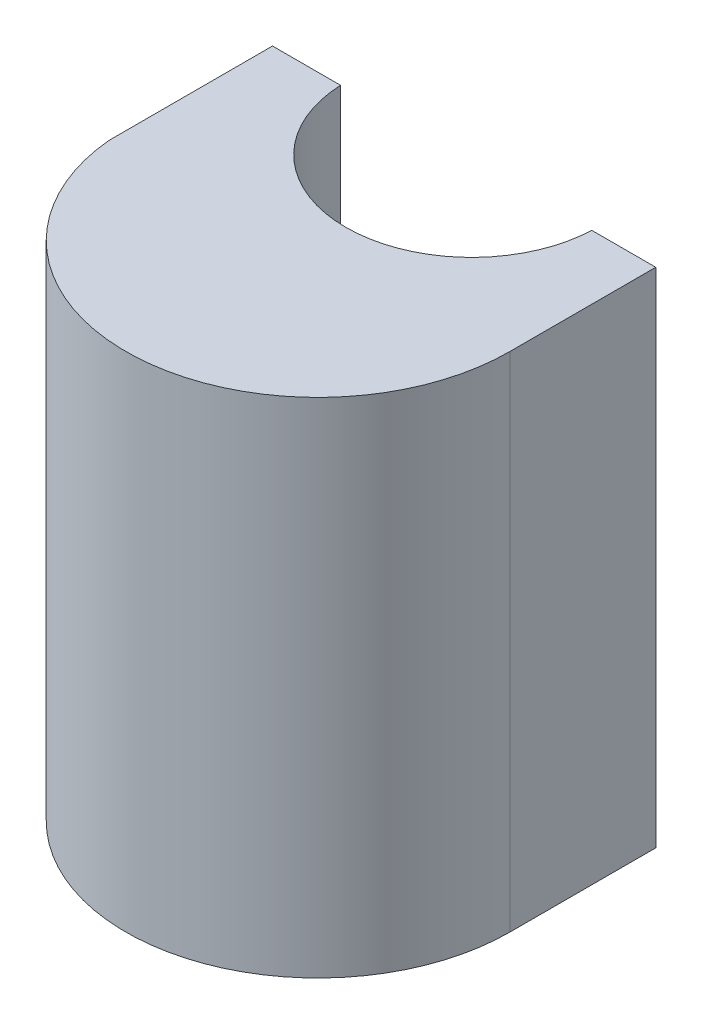
ISO-10303-21;
HEADER;
FILE_DESCRIPTION(('STEP AP214'),'2;1');
FILE_NAME('part.step','',(''),(''),'','','');
FILE_SCHEMA(('AUTOMOTIVE_DESIGN { 1 0 10303 214 1 1 1 1 }'));
ENDSEC;
DATA;
#1=APPLICATION_CONTEXT('core data for automotive mechanical design processes');
#2=APPLICATION_PROTOCOL_DEFINITION('international standard','automotive_design',2000,#1);
#3=PRODUCT_CONTEXT('',#1,'mechanical');
#4=PRODUCT('Part','Part','',(#3));
#5=PRODUCT_RELATED_PRODUCT_CATEGORY('part','',(#4));
#6=PRODUCT_DEFINITION_FORMATION('','',#4);
#7=PRODUCT_DEFINITION_CONTEXT('part definition',#1,'design');
#8=PRODUCT_DEFINITION('design','',#6,#7);
#9=PRODUCT_DEFINITION_SHAPE('','',#8);
#10=(LENGTH_UNIT() NAMED_UNIT(*) SI_UNIT(.MILLI.,.METRE.));
#11=(NAMED_UNIT(*) PLANE_ANGLE_UNIT() SI_UNIT($,.RADIAN.));
#12=(NAMED_UNIT(*) SI_UNIT($,.STERADIAN.) SOLID_ANGLE_UNIT());
#13=UNCERTAINTY_MEASURE_WITH_UNIT(LENGTH_MEASURE(1.E-05),#10,'distance_accuracy_value','');
#14=(GEOMETRIC_REPRESENTATION_CONTEXT(3) GLOBAL_UNCERTAINTY_ASSIGNED_CONTEXT((#13)) GLOBAL_UNIT_ASSIGNED_CONTEXT((#10,
#11,#12)) REPRESENTATION_CONTEXT('',''));
#15=CARTESIAN_POINT('',(0.,0.,0.));
#16=DIRECTION('',(0.,0.,1.));
#17=DIRECTION('',(1.,0.,0.));
#18=AXIS2_PLACEMENT_3D('',#15,#16,#17);
#19=CARTESIAN_POINT('',(1.26536763995208,2.87183105039429,15.5890947887312));
#20=DIRECTION('',(0.,1.,0.));
#21=DIRECTION('',(0.,0.,-1.));
#22=AXIS2_PLACEMENT_3D('',#19,#20,#21);
#23=PLANE('',#22);
#24=DIRECTION('',(2.31603663807447E-12,0.,-1.));
#25=VECTOR('',#24,1.);
#26=CARTESIAN_POINT('',(-5.63585159552637,2.87183105039428,7.0923266892118));
#27=LINE('',#26,#25);
#28=CARTESIAN_POINT('',(-5.63585159552637,2.87183105039428,7.0923266892118));
#29=VERTEX_POINT('',#28);
#30=CARTESIAN_POINT('',(-5.63585159552547,2.87183105039428,6.70112871047515));
#31=VERTEX_POINT('',#30);
#32=EDGE_CURVE('E105',#29,#31,#27,.T.);
#33=ORIENTED_EDGE('',*,*,#32,.F.);
#34=CARTESIAN_POINT('',(-5.17955820054254,2.87183105039428,7.04923878887403));
#35=DIRECTION('',(0.,1.,0.));
#36=DIRECTION('',(-0.995571061700838,0.,0.0940120263788917));
#37=AXIS2_PLACEMENT_3D('',#34,#35,#36);
#38=CIRCLE('',#37,0.458323280514298);
#39=CARTESIAN_POINT('',(-4.72123492002826,2.87183105039428,7.04923878887417));
#40=VERTEX_POINT('',#39);
#41=EDGE_CURVE('E100',#29,#40,#38,.T.);
#42=ORIENTED_EDGE('',*,*,#41,.T.);
#43=DIRECTION('',(7.39892430869169E-12,0.,1.));
#44=VECTOR('',#43,1.);
#45=CARTESIAN_POINT('',(-4.72123492003083,2.87183105039428,6.70112871047536));
#46=LINE('',#45,#44);
#47=CARTESIAN_POINT('',(-4.72123492003083,2.87183105039428,6.70112871047536));
#48=VERTEX_POINT('',#47);
#49=EDGE_CURVE('E26',#48,#40,#46,.T.);
#50=ORIENTED_EDGE('',*,*,#49,.F.);
#51=DIRECTION('',(-1.,0.,-5.81579420434685E-13));
#52=VECTOR('',#51,1.);
#53=CARTESIAN_POINT('',(-4.72123492003083,2.87183105039428,6.70112871047536));
#54=LINE('',#53,#52);
#55=CARTESIAN_POINT('',(-4.87380129724814,2.87183105039428,6.70112871047527));
#56=VERTEX_POINT('',#55);
#57=EDGE_CURVE('E11',#48,#56,#54,.T.);
#58=ORIENTED_EDGE('',*,*,#57,.T.);
#59=CARTESIAN_POINT('',(-5.17353236004814,2.87183105039428,6.68842871047527));
#60=DIRECTION('',(0.,1.,0.));
#61=DIRECTION('',(-0.999103542626009,0.,0.0423333333457055));
#62=AXIS2_PLACEMENT_3D('',#59,#60,#61);
#63=CIRCLE('',#62,0.299999999999993);
#64=CARTESIAN_POINT('',(-5.17363750475006,2.87183105039428,6.9884286920496));
#65=VERTEX_POINT('',#64);
#66=EDGE_CURVE('E136',#65,#56,#63,.T.);
#67=ORIENTED_EDGE('',*,*,#66,.F.);
#68=CARTESIAN_POINT('',(-5.17374264940921,2.87183105039428,6.68842871047527));
#69=DIRECTION('',(0.,1.,0.));
#70=DIRECTION('',(0.,0.,1.));
#71=AXIS2_PLACEMENT_3D('',#68,#69,#70);
#72=CIRCLE('',#71,0.299999999999994);
#73=CARTESIAN_POINT('',(-5.47347371219718,2.87183105039428,6.70112871047518));
#74=VERTEX_POINT('',#73);
#75=EDGE_CURVE('E152',#74,#65,#72,.T.);
#76=ORIENTED_EDGE('',*,*,#75,.F.);
#77=DIRECTION('',(-1.,0.,-2.19014998791785E-13));
#78=VECTOR('',#77,1.);
#79=CARTESIAN_POINT('',(-5.47347371219718,2.87183105039428,6.70112871047518));
#80=LINE('',#79,#78);
#81=EDGE_CURVE('E106',#74,#31,#80,.T.);
#82=ORIENTED_EDGE('',*,*,#81,.T.);
#83=EDGE_LOOP('',(#33,#42,#50,#58,#67,#76,#82));
#84=FACE_BOUND('',#83,.T.);
#85=ADVANCED_FACE('F17',(#84),#23,.T.);
#86=CARTESIAN_POINT('',(-4.87380129724814,2.87183105039428,6.70112871047527));
#87=DIRECTION('',(5.81579420434685E-13,0.,-1.));
#88=DIRECTION('',(0.,-1.,0.));
#89=AXIS2_PLACEMENT_3D('',#86,#87,#88);
#90=PLANE('',#89);
#91=DIRECTION('',(-1.,0.,-5.81579420434685E-13));
#92=VECTOR('',#91,1.);
#93=CARTESIAN_POINT('',(-1.80421682864544,1.6718310055699,6.70112871047706));
#94=LINE('',#93,#92);
#95=CARTESIAN_POINT('',(-4.72123492003083,1.6718310055699,6.70112871047536));
#96=VERTEX_POINT('',#95);
#97=CARTESIAN_POINT('',(-4.87380129724813,1.6718310055699,6.70112871047527));
#98=VERTEX_POINT('',#97);
#99=EDGE_CURVE('E156',#96,#98,#94,.T.);
#100=ORIENTED_EDGE('',*,*,#99,.T.);
#101=DIRECTION('',(0.,-1.,0.));
#102=VECTOR('',#101,1.);
#103=CARTESIAN_POINT('',(-4.87380129724814,2.87183105039428,6.70112871047527));
#104=LINE('',#103,#102);
#105=EDGE_CURVE('E139',#56,#98,#104,.T.);
#106=ORIENTED_EDGE('',*,*,#105,.F.);
#107=ORIENTED_EDGE('',*,*,#57,.F.);
#108=DIRECTION('',(0.,-1.,0.));
#109=VECTOR('',#108,1.);
#110=CARTESIAN_POINT('',(-4.72123492003083,2.87183105039428,6.70112871047536));
#111=LINE('',#110,#109);
#112=EDGE_CURVE('E165',#48,#96,#111,.T.);
#113=ORIENTED_EDGE('',*,*,#112,.T.);
#114=EDGE_LOOP('',(#100,#106,#107,#113));
#115=FACE_BOUND('',#114,.T.);
#116=ADVANCED_FACE('F307',(#115),#90,.T.);
#117=CARTESIAN_POINT('',(-4.72123492003083,2.87183105039428,6.70112871047536));
#118=DIRECTION('',(1.,0.,-7.39892430869169E-12));
#119=DIRECTION('',(-7.39892430869169E-12,0.,-1.));
#120=AXIS2_PLACEMENT_3D('',#117,#118,#119);
#121=PLANE('',#120);
#122=DIRECTION('',(-7.39892430869169E-12,0.,-1.));
#123=VECTOR('',#122,1.);
#124=CARTESIAN_POINT('',(-4.72123491999795,1.6718310055699,11.1451117496254));
#125=LINE('',#124,#123);
#126=CARTESIAN_POINT('',(-4.72123492002825,1.6718310055699,7.04923878887417));
#127=VERTEX_POINT('',#126);
#128=EDGE_CURVE('E115',#127,#96,#125,.T.);
#129=ORIENTED_EDGE('',*,*,#128,.T.);
#130=ORIENTED_EDGE('',*,*,#112,.F.);
#131=ORIENTED_EDGE('',*,*,#49,.T.);
#132=DIRECTION('',(0.,-1.,0.));
#133=VECTOR('',#132,1.);
#134=CARTESIAN_POINT('',(-4.72123492002826,2.87183105039428,7.04923878887417));
#135=LINE('',#134,#133);
#136=EDGE_CURVE('E135',#40,#127,#135,.T.);
#137=ORIENTED_EDGE('',*,*,#136,.T.);
#138=EDGE_LOOP('',(#129,#130,#131,#137));
#139=FACE_BOUND('',#138,.T.);
#140=ADVANCED_FACE('F19',(#139),#121,.T.);
#141=CARTESIAN_POINT('',(-5.17955820054254,2.87183105039428,7.04923878887403));
#142=DIRECTION('',(0.,-1.,0.));
#143=DIRECTION('',(-0.995571061700838,0.,0.0940120263788917));
#144=AXIS2_PLACEMENT_3D('',#141,#142,#143);
#145=CYLINDRICAL_SURFACE('',#144,0.458323280514298);
#146=CARTESIAN_POINT('',(-5.17955820054254,1.6718310055699,7.04923878887403));
#147=DIRECTION('',(0.,1.,0.));
#148=DIRECTION('',(-0.995571061700838,0.,0.0940120263788917));
#149=AXIS2_PLACEMENT_3D('',#146,#147,#148);
#150=CIRCLE('',#149,0.458323280514298);
#151=CARTESIAN_POINT('',(-5.63585159552637,1.6718310055699,7.0923266892118));
#152=VERTEX_POINT('',#151);
#153=EDGE_CURVE('E98',#152,#127,#150,.T.);
#154=ORIENTED_EDGE('',*,*,#153,.T.);
#155=ORIENTED_EDGE('',*,*,#136,.F.);
#156=ORIENTED_EDGE('',*,*,#41,.F.);
#157=DIRECTION('',(0.,-1.,0.));
#158=VECTOR('',#157,1.);
#159=CARTESIAN_POINT('',(-5.63585159552637,2.87183105039428,7.0923266892118));
#160=LINE('',#159,#158);
#161=EDGE_CURVE('E94',#29,#152,#160,.T.);
#162=ORIENTED_EDGE('',*,*,#161,.T.);
#163=EDGE_LOOP('',(#154,#155,#156,#162));
#164=FACE_BOUND('',#163,.T.);
#165=ADVANCED_FACE('F96',(#164),#145,.T.);
#166=CARTESIAN_POINT('',(-5.63585159552637,2.87183105039428,7.0923266892118));
#167=DIRECTION('',(-1.,0.,-2.31603663807447E-12));
#168=DIRECTION('',(-2.31603663807447E-12,0.,1.));
#169=AXIS2_PLACEMENT_3D('',#166,#167,#168);
#170=PLANE('',#169);
#171=DIRECTION('',(-2.31603663807447E-12,0.,1.));
#172=VECTOR('',#171,1.);
#173=CARTESIAN_POINT('',(-5.63585159553621,1.6718310055699,11.3407107389635));
#174=LINE('',#173,#172);
#175=CARTESIAN_POINT('',(-5.63585159552546,1.6718310055699,6.70112871047515));
#176=VERTEX_POINT('',#175);
#177=EDGE_CURVE('E112',#176,#152,#174,.T.);
#178=ORIENTED_EDGE('',*,*,#177,.T.);
#179=ORIENTED_EDGE('',*,*,#161,.F.);
#180=ORIENTED_EDGE('',*,*,#32,.T.);
#181=DIRECTION('',(0.,-1.,0.));
#182=VECTOR('',#181,1.);
#183=CARTESIAN_POINT('',(-5.63585159552547,2.87183105039428,6.70112871047515));
#184=LINE('',#183,#182);
#185=EDGE_CURVE('E121',#31,#176,#184,.T.);
#186=ORIENTED_EDGE('',*,*,#185,.T.);
#187=EDGE_LOOP('',(#178,#179,#180,#186));
#188=FACE_BOUND('',#187,.T.);
#189=ADVANCED_FACE('F119',(#188),#170,.T.);
#190=CARTESIAN_POINT('',(-5.63585159552547,2.87183105039428,6.70112871047515));
#191=DIRECTION('',(2.19014998791785E-13,0.,-1.));
#192=DIRECTION('',(0.,-1.,0.));
#193=AXIS2_PLACEMENT_3D('',#190,#191,#192);
#194=PLANE('',#193);
#195=DIRECTION('',(-1.,0.,-2.19014998791785E-13));
#196=VECTOR('',#195,1.);
#197=CARTESIAN_POINT('',(-2.18524197778572,1.6718310055699,6.7011287104759));
#198=LINE('',#197,#196);
#199=CARTESIAN_POINT('',(-5.47347371219717,1.6718310055699,6.70112871047518));
#200=VERTEX_POINT('',#199);
#201=EDGE_CURVE('E124',#200,#176,#198,.T.);
#202=ORIENTED_EDGE('',*,*,#201,.T.);
#203=ORIENTED_EDGE('',*,*,#185,.F.);
#204=ORIENTED_EDGE('',*,*,#81,.F.);
#205=DIRECTION('',(0.,-1.,0.));
#206=VECTOR('',#205,1.);
#207=CARTESIAN_POINT('',(-5.47347371219718,2.87183105039428,6.70112871047518));
#208=LINE('',#207,#206);
#209=EDGE_CURVE('E162',#74,#200,#208,.T.);
#210=ORIENTED_EDGE('',*,*,#209,.T.);
#211=EDGE_LOOP('',(#202,#203,#204,#210));
#212=FACE_BOUND('',#211,.T.);
#213=ADVANCED_FACE('F271',(#212),#194,.T.);
#214=CARTESIAN_POINT('',(-5.17374264940921,2.87183105039428,6.68842871047527));
#215=DIRECTION('',(0.,-1.,0.));
#216=DIRECTION('',(0.,0.,1.));
#217=AXIS2_PLACEMENT_3D('',#214,#215,#216);
#218=CYLINDRICAL_SURFACE('',#217,0.299999999999994);
#219=CARTESIAN_POINT('',(-5.17374264940921,1.6718310055699,6.68842871047527));
#220=DIRECTION('',(0.,-1.,0.));
#221=DIRECTION('',(0.,0.,1.));
#222=AXIS2_PLACEMENT_3D('',#219,#220,#221);
#223=CIRCLE('',#222,0.299999999999994);
#224=CARTESIAN_POINT('',(-5.17363750475005,1.6718310055699,6.9884286920496));
#225=VERTEX_POINT('',#224);
#226=EDGE_CURVE('E130',#225,#200,#223,.T.);
#227=ORIENTED_EDGE('',*,*,#226,.T.);
#228=ORIENTED_EDGE('',*,*,#209,.F.);
#229=ORIENTED_EDGE('',*,*,#75,.T.);
#230=DIRECTION('',(0.,-1.,0.));
#231=VECTOR('',#230,1.);
#232=CARTESIAN_POINT('',(-5.17363750475006,2.87183105039428,6.9884286920496));
#233=LINE('',#232,#231);
#234=EDGE_CURVE('E117',#65,#225,#233,.T.);
#235=ORIENTED_EDGE('',*,*,#234,.T.);
#236=EDGE_LOOP('',(#227,#228,#229,#235));
#237=FACE_BOUND('',#236,.T.);
#238=ADVANCED_FACE('F259',(#237),#218,.F.);
#239=CARTESIAN_POINT('',(-5.17353236004814,2.87183105039428,6.68842871047527));
#240=DIRECTION('',(0.,-1.,0.));
#241=DIRECTION('',(-0.999103542626009,0.,0.0423333333457054));
#242=AXIS2_PLACEMENT_3D('',#239,#240,#241);
#243=CYLINDRICAL_SURFACE('',#242,0.299999999999993);
#244=CARTESIAN_POINT('',(-5.17353236004814,1.6718310055699,6.68842871047527));
#245=DIRECTION('',(0.,-1.,0.));
#246=DIRECTION('',(-0.999103542626009,0.,0.0423333333457055));
#247=AXIS2_PLACEMENT_3D('',#244,#245,#246);
#248=CIRCLE('',#247,0.299999999999993);
#249=EDGE_CURVE('E149',#98,#225,#248,.T.);
#250=ORIENTED_EDGE('',*,*,#249,.T.);
#251=ORIENTED_EDGE('',*,*,#234,.F.);
#252=ORIENTED_EDGE('',*,*,#66,.T.);
#253=ORIENTED_EDGE('',*,*,#105,.T.);
#254=EDGE_LOOP('',(#250,#251,#252,#253));
#255=FACE_BOUND('',#254,.T.);
#256=ADVANCED_FACE('F247',(#255),#243,.F.);
#257=CARTESIAN_POINT('',(1.26536763995209,1.6718310055699,15.5890947887312));
#258=DIRECTION('',(0.,1.,0.));
#259=DIRECTION('',(0.,0.,-1.));
#260=AXIS2_PLACEMENT_3D('',#257,#258,#259);
#261=PLANE('',#260);
#262=ORIENTED_EDGE('',*,*,#177,.F.);
#263=ORIENTED_EDGE('',*,*,#201,.F.);
#264=ORIENTED_EDGE('',*,*,#226,.F.);
#265=ORIENTED_EDGE('',*,*,#249,.F.);
#266=ORIENTED_EDGE('',*,*,#99,.F.);
#267=ORIENTED_EDGE('',*,*,#128,.F.);
#268=ORIENTED_EDGE('',*,*,#153,.F.);
#269=EDGE_LOOP('',(#262,#263,#264,#265,#266,#267,#268));
#270=FACE_BOUND('',#269,.T.);
#271=ADVANCED_FACE('F110',(#270),#261,.F.);
#272=CLOSED_SHELL('',(#85,#116,#140,#165,#189,#213,#238,#256,#271));
#273=MANIFOLD_SOLID_BREP('B1',#272);
#274=ADVANCED_BREP_SHAPE_REPRESENTATION('',(#18,#273),#14);
#275=SHAPE_DEFINITION_REPRESENTATION(#9,#274);
ENDSEC;
END-ISO-10303-21;
